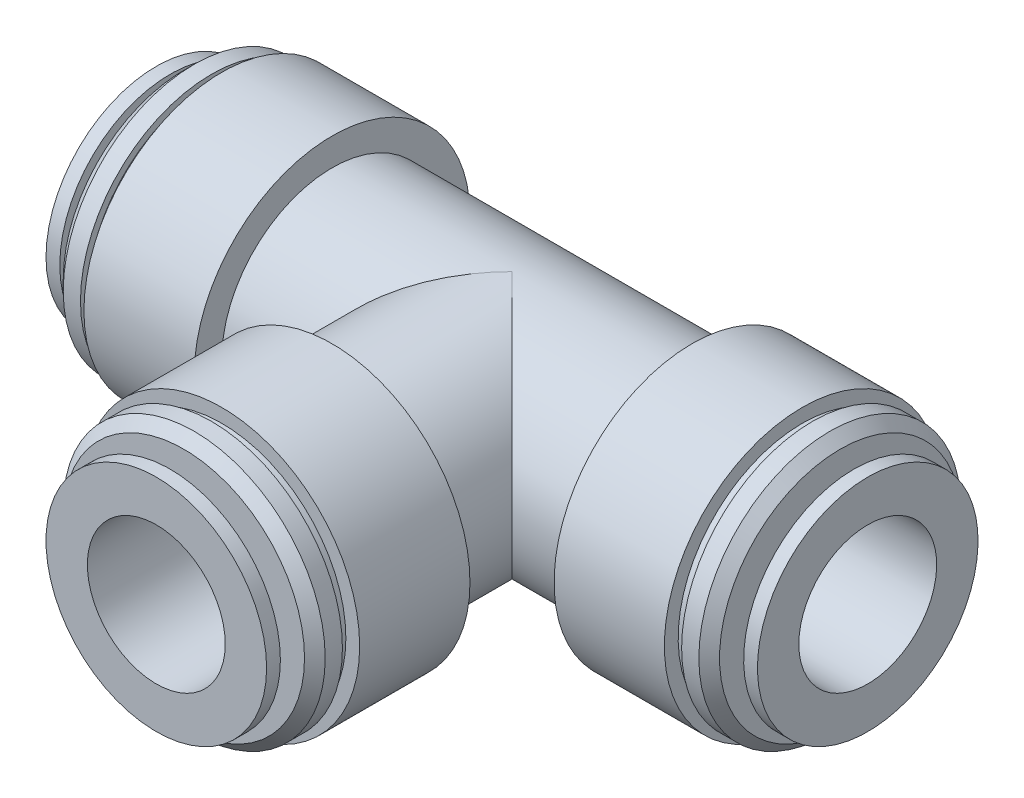
ISO-10303-21;
HEADER;
FILE_DESCRIPTION(('STEP AP214'),'2;1');
FILE_NAME('part.step','',(''),(''),'','','');
FILE_SCHEMA(('AUTOMOTIVE_DESIGN { 1 0 10303 214 1 1 1 1 }'));
ENDSEC;
DATA;
#1=APPLICATION_CONTEXT('core data for automotive mechanical design processes');
#2=APPLICATION_PROTOCOL_DEFINITION('international standard','automotive_design',2000,#1);
#3=PRODUCT_CONTEXT('',#1,'mechanical');
#4=PRODUCT('Part','Part','',(#3));
#5=PRODUCT_RELATED_PRODUCT_CATEGORY('part','',(#4));
#6=PRODUCT_DEFINITION_FORMATION('','',#4);
#7=PRODUCT_DEFINITION_CONTEXT('part definition',#1,'design');
#8=PRODUCT_DEFINITION('design','',#6,#7);
#9=PRODUCT_DEFINITION_SHAPE('','',#8);
#10=(LENGTH_UNIT() NAMED_UNIT(*) SI_UNIT(.MILLI.,.METRE.));
#11=(NAMED_UNIT(*) PLANE_ANGLE_UNIT() SI_UNIT($,.RADIAN.));
#12=(NAMED_UNIT(*) SI_UNIT($,.STERADIAN.) SOLID_ANGLE_UNIT());
#13=UNCERTAINTY_MEASURE_WITH_UNIT(LENGTH_MEASURE(1.E-05),#10,'distance_accuracy_value','');
#14=(GEOMETRIC_REPRESENTATION_CONTEXT(3) GLOBAL_UNCERTAINTY_ASSIGNED_CONTEXT((#13)) GLOBAL_UNIT_ASSIGNED_CONTEXT((#10,
#11,#12)) REPRESENTATION_CONTEXT('',''));
#15=CARTESIAN_POINT('',(0.,0.,0.));
#16=DIRECTION('',(0.,0.,1.));
#17=DIRECTION('',(1.,0.,0.));
#18=AXIS2_PLACEMENT_3D('',#15,#16,#17);
#19=CARTESIAN_POINT('',(45.3,0.,0.));
#20=DIRECTION('',(-1.,0.,0.));
#21=DIRECTION('',(0.,0.,1.));
#22=AXIS2_PLACEMENT_3D('',#19,#20,#21);
#23=CYLINDRICAL_SURFACE('',#22,5.);
#24=CARTESIAN_POINT('',(-17.75,0.,0.));
#25=DIRECTION('',(-1.,0.,0.));
#26=DIRECTION('',(0.,0.,1.));
#27=AXIS2_PLACEMENT_3D('',#24,#25,#26);
#28=CIRCLE('',#27,5.);
#29=CARTESIAN_POINT('',(-17.75,0.,5.));
#30=VERTEX_POINT('',#29);
#31=EDGE_CURVE('E78',#30,#30,#28,.T.);
#32=ORIENTED_EDGE('',*,*,#31,.T.);
#33=EDGE_LOOP('',(#32));
#34=FACE_BOUND('',#33,.T.);
#35=CARTESIAN_POINT('',(33.8500000000001,0.,0.));
#36=DIRECTION('',(1.,0.,0.));
#37=DIRECTION('',(0.,1.,0.));
#38=AXIS2_PLACEMENT_3D('',#35,#36,#37);
#39=CIRCLE('',#38,5.);
#40=CARTESIAN_POINT('',(33.8500000000001,5.,0.));
#41=VERTEX_POINT('',#40);
#42=EDGE_CURVE('E85',#41,#41,#39,.T.);
#43=ORIENTED_EDGE('',*,*,#42,.T.);
#44=EDGE_LOOP('',(#43));
#45=FACE_BOUND('',#44,.T.);
#46=DIRECTION('',(-1.,0.,0.));
#47=VECTOR('',#46,1.);
#48=CARTESIAN_POINT('',(45.3,4.93558507170123,0.799999999999988));
#49=LINE('',#48,#47);
#50=CARTESIAN_POINT('',(7.25000000000004,4.93558507170123,0.799999999999988));
#51=VERTEX_POINT('',#50);
#52=CARTESIAN_POINT('',(8.84999999999999,4.93558507170123,0.799999999999988));
#53=VERTEX_POINT('',#52);
#54=EDGE_CURVE('E11',#51,#53,#49,.F.);
#55=ORIENTED_EDGE('',*,*,#54,.F.);
#56=CARTESIAN_POINT('',(8.05000000000001,0.,0.));
#57=DIRECTION('',(-0.707106781186547,0.,-0.707106781186547));
#58=DIRECTION('',(-0.707106781186547,0.,0.707106781186547));
#59=AXIS2_PLACEMENT_3D('',#56,#57,#58);
#60=ELLIPSE('',#59,7.07106781186547,5.);
#61=CARTESIAN_POINT('',(7.25000000000004,-4.93558507170123,0.799999999999988));
#62=VERTEX_POINT('',#61);
#63=EDGE_CURVE('E77',#51,#62,#60,.F.);
#64=ORIENTED_EDGE('',*,*,#63,.T.);
#65=DIRECTION('',(-1.,0.,0.));
#66=VECTOR('',#65,1.);
#67=CARTESIAN_POINT('',(45.3,-4.93558507170123,0.799999999999988));
#68=LINE('',#67,#66);
#69=CARTESIAN_POINT('',(8.84999999999999,-4.93558507170123,0.799999999999988));
#70=VERTEX_POINT('',#69);
#71=EDGE_CURVE('E80',#70,#62,#68,.T.);
#72=ORIENTED_EDGE('',*,*,#71,.F.);
#73=CARTESIAN_POINT('',(8.05000000000001,0.,0.));
#74=DIRECTION('',(-0.707106781186547,0.,0.707106781186547));
#75=DIRECTION('',(-0.707106781186547,0.,-0.707106781186547));
#76=AXIS2_PLACEMENT_3D('',#73,#74,#75);
#77=ELLIPSE('',#76,7.07106781186547,5.);
#78=EDGE_CURVE('E42',#70,#53,#77,.T.);
#79=ORIENTED_EDGE('',*,*,#78,.T.);
#80=EDGE_LOOP('',(#55,#64,#72,#79));
#81=FACE_BOUND('',#80,.T.);
#82=ADVANCED_FACE('F34',(#34,#45,#81),#23,.F.);
#83=CARTESIAN_POINT('',(21.1,0.,0.));
#84=DIRECTION('',(-1.,0.,0.));
#85=DIRECTION('',(0.,0.,1.));
#86=AXIS2_PLACEMENT_3D('',#83,#84,#85);
#87=CYLINDRICAL_SURFACE('',#86,8.);
#88=CARTESIAN_POINT('',(-4.99999999999998,0.,0.));
#89=DIRECTION('',(1.,0.,0.));
#90=DIRECTION('',(0.,0.,-1.));
#91=AXIS2_PLACEMENT_3D('',#88,#89,#90);
#92=CIRCLE('',#91,8.);
#93=CARTESIAN_POINT('',(-4.99999999999998,0.,-8.));
#94=VERTEX_POINT('',#93);
#95=EDGE_CURVE('E91',#94,#94,#92,.T.);
#96=ORIENTED_EDGE('',*,*,#95,.T.);
#97=EDGE_LOOP('',(#96));
#98=FACE_BOUND('',#97,.T.);
#99=CARTESIAN_POINT('',(21.1,0.,0.));
#100=DIRECTION('',(1.,0.,0.));
#101=DIRECTION('',(0.,0.,-1.));
#102=AXIS2_PLACEMENT_3D('',#99,#100,#101);
#103=CIRCLE('',#102,8.);
#104=CARTESIAN_POINT('',(21.1,0.,-8.));
#105=VERTEX_POINT('',#104);
#106=EDGE_CURVE('E125',#105,#105,#103,.T.);
#107=ORIENTED_EDGE('',*,*,#106,.F.);
#108=EDGE_LOOP('',(#107));
#109=FACE_BOUND('',#108,.T.);
#110=CARTESIAN_POINT('',(8.05000000000002,0.,0.));
#111=DIRECTION('',(-0.707106781186547,0.,-0.707106781186547));
#112=DIRECTION('',(-0.707106781186547,0.,0.707106781186547));
#113=AXIS2_PLACEMENT_3D('',#110,#111,#112);
#114=ELLIPSE('',#113,11.3137084989848,8.);
#115=CARTESIAN_POINT('',(8.05000000000002,8.,0.));
#116=VERTEX_POINT('',#115);
#117=CARTESIAN_POINT('',(8.05000000000002,-8.,0.));
#118=VERTEX_POINT('',#117);
#119=EDGE_CURVE('E84',#116,#118,#114,.F.);
#120=ORIENTED_EDGE('',*,*,#119,.F.);
#121=CARTESIAN_POINT('',(8.05000000000002,0.,0.));
#122=DIRECTION('',(-0.707106781186547,0.,0.707106781186547));
#123=DIRECTION('',(-0.707106781186547,0.,-0.707106781186547));
#124=AXIS2_PLACEMENT_3D('',#121,#122,#123);
#125=ELLIPSE('',#124,11.3137084989848,8.);
#126=EDGE_CURVE('E55',#118,#116,#125,.T.);
#127=ORIENTED_EDGE('',*,*,#126,.F.);
#128=EDGE_LOOP('',(#120,#127));
#129=FACE_BOUND('',#128,.T.);
#130=ADVANCED_FACE('F224',(#98,#109,#129),#87,.T.);
#131=CARTESIAN_POINT('',(-21.0494892323431,0.,0.));
#132=DIRECTION('',(-1.,0.,0.));
#133=DIRECTION('',(0.,0.,1.));
#134=AXIS2_PLACEMENT_3D('',#131,#132,#133);
#135=CYLINDRICAL_SURFACE('',#134,10.);
#136=CARTESIAN_POINT('',(-4.99999999999998,0.,0.));
#137=DIRECTION('',(-1.,0.,0.));
#138=DIRECTION('',(0.,0.,1.));
#139=AXIS2_PLACEMENT_3D('',#136,#137,#138);
#140=CIRCLE('',#139,10.);
#141=CARTESIAN_POINT('',(-4.99999999999998,0.,10.));
#142=VERTEX_POINT('',#141);
#143=EDGE_CURVE('E92',#142,#142,#140,.T.);
#144=ORIENTED_EDGE('',*,*,#143,.T.);
#145=EDGE_LOOP('',(#144));
#146=FACE_BOUND('',#145,.T.);
#147=CARTESIAN_POINT('',(-13.,0.,0.));
#148=DIRECTION('',(-1.,0.,0.));
#149=DIRECTION('',(0.,0.,1.));
#150=AXIS2_PLACEMENT_3D('',#147,#148,#149);
#151=CIRCLE('',#150,10.);
#152=CARTESIAN_POINT('',(-13.,0.,10.));
#153=VERTEX_POINT('',#152);
#154=EDGE_CURVE('E122',#153,#153,#151,.T.);
#155=ORIENTED_EDGE('',*,*,#154,.F.);
#156=EDGE_LOOP('',(#155));
#157=FACE_BOUND('',#156,.T.);
#158=ADVANCED_FACE('F36',(#146,#157),#135,.T.);
#159=CARTESIAN_POINT('',(-4.99999999999998,-10.,0.));
#160=DIRECTION('',(1.,0.,0.));
#161=DIRECTION('',(0.,0.,-1.));
#162=AXIS2_PLACEMENT_3D('',#159,#160,#161);
#163=PLANE('',#162);
#164=ORIENTED_EDGE('',*,*,#95,.F.);
#165=EDGE_LOOP('',(#164));
#166=FACE_BOUND('',#165,.T.);
#167=ORIENTED_EDGE('',*,*,#143,.F.);
#168=EDGE_LOOP('',(#167));
#169=FACE_BOUND('',#168,.T.);
#170=ADVANCED_FACE('F580',(#166,#169),#163,.T.);
#171=CARTESIAN_POINT('',(-17.75,-4.,0.));
#172=DIRECTION('',(-1.,0.,0.));
#173=DIRECTION('',(0.,0.,1.));
#174=AXIS2_PLACEMENT_3D('',#171,#172,#173);
#175=PLANE('',#174);
#176=ORIENTED_EDGE('',*,*,#31,.F.);
#177=EDGE_LOOP('',(#176));
#178=FACE_BOUND('',#177,.T.);
#179=CARTESIAN_POINT('',(-17.75,0.,0.));
#180=DIRECTION('',(-1.,0.,0.));
#181=DIRECTION('',(0.,0.,1.));
#182=AXIS2_PLACEMENT_3D('',#179,#180,#181);
#183=CIRCLE('',#182,8.);
#184=CARTESIAN_POINT('',(-17.75,0.,8.));
#185=VERTEX_POINT('',#184);
#186=EDGE_CURVE('E95',#185,#185,#183,.T.);
#187=ORIENTED_EDGE('',*,*,#186,.T.);
#188=EDGE_LOOP('',(#187));
#189=FACE_BOUND('',#188,.T.);
#190=ADVANCED_FACE('F571',(#178,#189),#175,.T.);
#191=CARTESIAN_POINT('',(-21.0494892323431,0.,0.));
#192=DIRECTION('',(-1.,0.,0.));
#193=DIRECTION('',(0.,0.,1.));
#194=AXIS2_PLACEMENT_3D('',#191,#192,#193);
#195=CYLINDRICAL_SURFACE('',#194,8.);
#196=CARTESIAN_POINT('',(-16.7499999999999,0.,0.));
#197=DIRECTION('',(-1.,0.,0.));
#198=DIRECTION('',(0.,0.,1.));
#199=AXIS2_PLACEMENT_3D('',#196,#197,#198);
#200=CIRCLE('',#199,8.);
#201=CARTESIAN_POINT('',(-16.7499999999999,0.,8.));
#202=VERTEX_POINT('',#201);
#203=EDGE_CURVE('E98',#202,#202,#200,.T.);
#204=ORIENTED_EDGE('',*,*,#203,.T.);
#205=EDGE_LOOP('',(#204));
#206=FACE_BOUND('',#205,.T.);
#207=ORIENTED_EDGE('',*,*,#186,.F.);
#208=EDGE_LOOP('',(#207));
#209=FACE_BOUND('',#208,.T.);
#210=ADVANCED_FACE('F562',(#206,#209),#195,.T.);
#211=CARTESIAN_POINT('',(-16.7499999999999,-8.,0.));
#212=DIRECTION('',(1.,0.,0.));
#213=DIRECTION('',(0.,0.,-1.));
#214=AXIS2_PLACEMENT_3D('',#211,#212,#213);
#215=PLANE('',#214);
#216=CARTESIAN_POINT('',(-16.7499999999999,0.,0.));
#217=DIRECTION('',(-1.,0.,0.));
#218=DIRECTION('',(0.,0.,1.));
#219=AXIS2_PLACEMENT_3D('',#216,#217,#218);
#220=CIRCLE('',#219,5.99999999999998);
#221=CARTESIAN_POINT('',(-16.7499999999999,0.,5.99999999999998));
#222=VERTEX_POINT('',#221);
#223=EDGE_CURVE('E101',#222,#222,#220,.T.);
#224=ORIENTED_EDGE('',*,*,#223,.T.);
#225=EDGE_LOOP('',(#224));
#226=FACE_BOUND('',#225,.T.);
#227=ORIENTED_EDGE('',*,*,#203,.F.);
#228=EDGE_LOOP('',(#227));
#229=FACE_BOUND('',#228,.T.);
#230=ADVANCED_FACE('F553',(#226,#229),#215,.T.);
#231=CARTESIAN_POINT('',(-21.0494892323431,0.,0.));
#232=DIRECTION('',(-1.,0.,0.));
#233=DIRECTION('',(0.,0.,1.));
#234=AXIS2_PLACEMENT_3D('',#231,#232,#233);
#235=CYLINDRICAL_SURFACE('',#234,5.99999999999998);
#236=CARTESIAN_POINT('',(-15.75,0.,0.));
#237=DIRECTION('',(-1.,0.,0.));
#238=DIRECTION('',(0.,0.,1.));
#239=AXIS2_PLACEMENT_3D('',#236,#237,#238);
#240=CIRCLE('',#239,5.99999999999998);
#241=CARTESIAN_POINT('',(-15.75,0.,5.99999999999998));
#242=VERTEX_POINT('',#241);
#243=EDGE_CURVE('E104',#242,#242,#240,.T.);
#244=ORIENTED_EDGE('',*,*,#243,.T.);
#245=EDGE_LOOP('',(#244));
#246=FACE_BOUND('',#245,.T.);
#247=ORIENTED_EDGE('',*,*,#223,.F.);
#248=EDGE_LOOP('',(#247));
#249=FACE_BOUND('',#248,.T.);
#250=ADVANCED_FACE('F544',(#246,#249),#235,.T.);
#251=CARTESIAN_POINT('',(-15.75,-5.99999999999998,0.));
#252=DIRECTION('',(-1.,0.,0.));
#253=DIRECTION('',(0.,0.,1.));
#254=AXIS2_PLACEMENT_3D('',#251,#252,#253);
#255=PLANE('',#254);
#256=CARTESIAN_POINT('',(-15.75,0.,0.));
#257=DIRECTION('',(-1.,0.,0.));
#258=DIRECTION('',(0.,0.,1.));
#259=AXIS2_PLACEMENT_3D('',#256,#257,#258);
#260=CIRCLE('',#259,8.74999999999998);
#261=CARTESIAN_POINT('',(-15.75,0.,8.74999999999998));
#262=VERTEX_POINT('',#261);
#263=EDGE_CURVE('E107',#262,#262,#260,.T.);
#264=ORIENTED_EDGE('',*,*,#263,.T.);
#265=EDGE_LOOP('',(#264));
#266=FACE_BOUND('',#265,.T.);
#267=ORIENTED_EDGE('',*,*,#243,.F.);
#268=EDGE_LOOP('',(#267));
#269=FACE_BOUND('',#268,.T.);
#270=ADVANCED_FACE('F535',(#266,#269),#255,.T.);
#271=CARTESIAN_POINT('',(-15.75,0.,0.));
#272=DIRECTION('',(1.,0.,0.));
#273=DIRECTION('',(0.,0.,-1.));
#274=AXIS2_PLACEMENT_3D('',#271,#272,#273);
#275=CONICAL_SURFACE('',#274,8.74999999999998,0.785398163397448);
#276=CARTESIAN_POINT('',(-15.,0.,0.));
#277=DIRECTION('',(-1.,0.,0.));
#278=DIRECTION('',(0.,0.,1.));
#279=AXIS2_PLACEMENT_3D('',#276,#277,#278);
#280=CIRCLE('',#279,9.49999999999998);
#281=CARTESIAN_POINT('',(-15.,0.,9.49999999999998));
#282=VERTEX_POINT('',#281);
#283=EDGE_CURVE('E110',#282,#282,#280,.T.);
#284=ORIENTED_EDGE('',*,*,#283,.T.);
#285=EDGE_LOOP('',(#284));
#286=FACE_BOUND('',#285,.T.);
#287=ORIENTED_EDGE('',*,*,#263,.F.);
#288=EDGE_LOOP('',(#287));
#289=FACE_BOUND('',#288,.T.);
#290=ADVANCED_FACE('F526',(#286,#289),#275,.T.);
#291=CARTESIAN_POINT('',(-21.0494892323431,0.,0.));
#292=DIRECTION('',(-1.,0.,0.));
#293=DIRECTION('',(0.,0.,1.));
#294=AXIS2_PLACEMENT_3D('',#291,#292,#293);
#295=CYLINDRICAL_SURFACE('',#294,9.49999999999998);
#296=CARTESIAN_POINT('',(-13.75,0.,0.));
#297=DIRECTION('',(-1.,0.,0.));
#298=DIRECTION('',(0.,0.,1.));
#299=AXIS2_PLACEMENT_3D('',#296,#297,#298);
#300=CIRCLE('',#299,9.49999999999998);
#301=CARTESIAN_POINT('',(-13.75,0.,9.49999999999998));
#302=VERTEX_POINT('',#301);
#303=EDGE_CURVE('E113',#302,#302,#300,.T.);
#304=ORIENTED_EDGE('',*,*,#303,.T.);
#305=EDGE_LOOP('',(#304));
#306=FACE_BOUND('',#305,.T.);
#307=ORIENTED_EDGE('',*,*,#283,.F.);
#308=EDGE_LOOP('',(#307));
#309=FACE_BOUND('',#308,.T.);
#310=ADVANCED_FACE('F517',(#306,#309),#295,.T.);
#311=CARTESIAN_POINT('',(-13.75,-9.49999999999998,0.));
#312=DIRECTION('',(1.,0.,0.));
#313=DIRECTION('',(0.,0.,-1.));
#314=AXIS2_PLACEMENT_3D('',#311,#312,#313);
#315=PLANE('',#314);
#316=CARTESIAN_POINT('',(-13.75,0.,0.));
#317=DIRECTION('',(-1.,0.,0.));
#318=DIRECTION('',(0.,0.,1.));
#319=AXIS2_PLACEMENT_3D('',#316,#317,#318);
#320=CIRCLE('',#319,8.99999999999996);
#321=CARTESIAN_POINT('',(-13.75,0.,8.99999999999996));
#322=VERTEX_POINT('',#321);
#323=EDGE_CURVE('E116',#322,#322,#320,.T.);
#324=ORIENTED_EDGE('',*,*,#323,.T.);
#325=EDGE_LOOP('',(#324));
#326=FACE_BOUND('',#325,.T.);
#327=ORIENTED_EDGE('',*,*,#303,.F.);
#328=EDGE_LOOP('',(#327));
#329=FACE_BOUND('',#328,.T.);
#330=ADVANCED_FACE('F508',(#326,#329),#315,.T.);
#331=CARTESIAN_POINT('',(-21.0494892323431,0.,0.));
#332=DIRECTION('',(-1.,0.,0.));
#333=DIRECTION('',(0.,0.,1.));
#334=AXIS2_PLACEMENT_3D('',#331,#332,#333);
#335=CYLINDRICAL_SURFACE('',#334,8.99999999999996);
#336=CARTESIAN_POINT('',(-13.,0.,0.));
#337=DIRECTION('',(-1.,0.,0.));
#338=DIRECTION('',(0.,0.,1.));
#339=AXIS2_PLACEMENT_3D('',#336,#337,#338);
#340=CIRCLE('',#339,8.99999999999996);
#341=CARTESIAN_POINT('',(-13.,0.,8.99999999999996));
#342=VERTEX_POINT('',#341);
#343=EDGE_CURVE('E119',#342,#342,#340,.T.);
#344=ORIENTED_EDGE('',*,*,#343,.T.);
#345=EDGE_LOOP('',(#344));
#346=FACE_BOUND('',#345,.T.);
#347=ORIENTED_EDGE('',*,*,#323,.F.);
#348=EDGE_LOOP('',(#347));
#349=FACE_BOUND('',#348,.T.);
#350=ADVANCED_FACE('F499',(#346,#349),#335,.T.);
#351=CARTESIAN_POINT('',(-13.,-8.99999999999996,0.));
#352=DIRECTION('',(-1.,0.,0.));
#353=DIRECTION('',(0.,0.,1.));
#354=AXIS2_PLACEMENT_3D('',#351,#352,#353);
#355=PLANE('',#354);
#356=ORIENTED_EDGE('',*,*,#154,.T.);
#357=EDGE_LOOP('',(#356));
#358=FACE_BOUND('',#357,.T.);
#359=ORIENTED_EDGE('',*,*,#343,.F.);
#360=EDGE_LOOP('',(#359));
#361=FACE_BOUND('',#360,.T.);
#362=ADVANCED_FACE('F489',(#358,#361),#355,.T.);
#363=CARTESIAN_POINT('',(47.149489232343,1.48318857196017E-13,0.));
#364=DIRECTION('',(1.,0.,0.));
#365=DIRECTION('',(0.,1.,0.));
#366=AXIS2_PLACEMENT_3D('',#363,#364,#365);
#367=CYLINDRICAL_SURFACE('',#366,10.);
#368=CARTESIAN_POINT('',(21.1000000000001,0.,0.));
#369=DIRECTION('',(1.,0.,0.));
#370=DIRECTION('',(0.,1.,0.));
#371=AXIS2_PLACEMENT_3D('',#368,#369,#370);
#372=CIRCLE('',#371,10.0000000000001);
#373=CARTESIAN_POINT('',(21.1,10.0000000000001,0.));
#374=VERTEX_POINT('',#373);
#375=EDGE_CURVE('E130',#374,#374,#372,.T.);
#376=ORIENTED_EDGE('',*,*,#375,.T.);
#377=EDGE_LOOP('',(#376));
#378=FACE_BOUND('',#377,.T.);
#379=CARTESIAN_POINT('',(29.1000000000001,0.,0.));
#380=DIRECTION('',(1.,0.,0.));
#381=DIRECTION('',(0.,1.,0.));
#382=AXIS2_PLACEMENT_3D('',#379,#380,#381);
#383=CIRCLE('',#382,10.);
#384=CARTESIAN_POINT('',(29.1,10.0000000000001,0.));
#385=VERTEX_POINT('',#384);
#386=EDGE_CURVE('E160',#385,#385,#383,.T.);
#387=ORIENTED_EDGE('',*,*,#386,.F.);
#388=EDGE_LOOP('',(#387));
#389=FACE_BOUND('',#388,.T.);
#390=ADVANCED_FACE('F480',(#378,#389),#367,.T.);
#391=CARTESIAN_POINT('',(21.1,10.0000000000001,0.));
#392=DIRECTION('',(-1.,0.,0.));
#393=DIRECTION('',(0.,-1.,0.));
#394=AXIS2_PLACEMENT_3D('',#391,#392,#393);
#395=PLANE('',#394);
#396=ORIENTED_EDGE('',*,*,#106,.T.);
#397=EDGE_LOOP('',(#396));
#398=FACE_BOUND('',#397,.T.);
#399=ORIENTED_EDGE('',*,*,#375,.F.);
#400=EDGE_LOOP('',(#399));
#401=FACE_BOUND('',#400,.T.);
#402=ADVANCED_FACE('F472',(#398,#401),#395,.T.);
#403=CARTESIAN_POINT('',(33.8500000000001,3.99999999999987,0.));
#404=DIRECTION('',(1.,0.,0.));
#405=DIRECTION('',(0.,1.,0.));
#406=AXIS2_PLACEMENT_3D('',#403,#404,#405);
#407=PLANE('',#406);
#408=ORIENTED_EDGE('',*,*,#42,.F.);
#409=EDGE_LOOP('',(#408));
#410=FACE_BOUND('',#409,.T.);
#411=CARTESIAN_POINT('',(33.8500000000002,0.,0.));
#412=DIRECTION('',(1.,0.,0.));
#413=DIRECTION('',(0.,1.,0.));
#414=AXIS2_PLACEMENT_3D('',#411,#412,#413);
#415=CIRCLE('',#414,8.00000000000002);
#416=CARTESIAN_POINT('',(33.8500000000001,8.00000000000011,0.));
#417=VERTEX_POINT('',#416);
#418=EDGE_CURVE('E133',#417,#417,#415,.T.);
#419=ORIENTED_EDGE('',*,*,#418,.T.);
#420=EDGE_LOOP('',(#419));
#421=FACE_BOUND('',#420,.T.);
#422=ADVANCED_FACE('F463',(#410,#421),#407,.T.);
#423=CARTESIAN_POINT('',(47.149489232343,1.48318857196017E-13,0.));
#424=DIRECTION('',(1.,0.,0.));
#425=DIRECTION('',(0.,1.,0.));
#426=AXIS2_PLACEMENT_3D('',#423,#424,#425);
#427=CYLINDRICAL_SURFACE('',#426,8.00000000000002);
#428=CARTESIAN_POINT('',(32.85,0.,0.));
#429=DIRECTION('',(1.,0.,0.));
#430=DIRECTION('',(0.,1.,0.));
#431=AXIS2_PLACEMENT_3D('',#428,#429,#430);
#432=CIRCLE('',#431,8.00000000000003);
#433=CARTESIAN_POINT('',(32.85,8.00000000000011,0.));
#434=VERTEX_POINT('',#433);
#435=EDGE_CURVE('E136',#434,#434,#432,.T.);
#436=ORIENTED_EDGE('',*,*,#435,.T.);
#437=EDGE_LOOP('',(#436));
#438=FACE_BOUND('',#437,.T.);
#439=ORIENTED_EDGE('',*,*,#418,.F.);
#440=EDGE_LOOP('',(#439));
#441=FACE_BOUND('',#440,.T.);
#442=ADVANCED_FACE('F454',(#438,#441),#427,.T.);
#443=CARTESIAN_POINT('',(32.85,8.00000000000011,0.));
#444=DIRECTION('',(-1.,0.,0.));
#445=DIRECTION('',(0.,-1.,0.));
#446=AXIS2_PLACEMENT_3D('',#443,#444,#445);
#447=PLANE('',#446);
#448=CARTESIAN_POINT('',(32.85,0.,0.));
#449=DIRECTION('',(1.,0.,0.));
#450=DIRECTION('',(0.,1.,0.));
#451=AXIS2_PLACEMENT_3D('',#448,#449,#450);
#452=CIRCLE('',#451,6.);
#453=CARTESIAN_POINT('',(32.85,6.00000000000008,0.));
#454=VERTEX_POINT('',#453);
#455=EDGE_CURVE('E139',#454,#454,#452,.T.);
#456=ORIENTED_EDGE('',*,*,#455,.T.);
#457=EDGE_LOOP('',(#456));
#458=FACE_BOUND('',#457,.T.);
#459=ORIENTED_EDGE('',*,*,#435,.F.);
#460=EDGE_LOOP('',(#459));
#461=FACE_BOUND('',#460,.T.);
#462=ADVANCED_FACE('F445',(#458,#461),#447,.T.);
#463=CARTESIAN_POINT('',(47.149489232343,1.48318857196017E-13,0.));
#464=DIRECTION('',(1.,0.,0.));
#465=DIRECTION('',(0.,1.,0.));
#466=AXIS2_PLACEMENT_3D('',#463,#464,#465);
#467=CYLINDRICAL_SURFACE('',#466,6.);
#468=CARTESIAN_POINT('',(31.85,0.,0.));
#469=DIRECTION('',(1.,0.,0.));
#470=DIRECTION('',(0.,1.,0.));
#471=AXIS2_PLACEMENT_3D('',#468,#469,#470);
#472=CIRCLE('',#471,6.);
#473=CARTESIAN_POINT('',(31.85,6.00000000000008,0.));
#474=VERTEX_POINT('',#473);
#475=EDGE_CURVE('E142',#474,#474,#472,.T.);
#476=ORIENTED_EDGE('',*,*,#475,.T.);
#477=EDGE_LOOP('',(#476));
#478=FACE_BOUND('',#477,.T.);
#479=ORIENTED_EDGE('',*,*,#455,.F.);
#480=EDGE_LOOP('',(#479));
#481=FACE_BOUND('',#480,.T.);
#482=ADVANCED_FACE('F436',(#478,#481),#467,.T.);
#483=CARTESIAN_POINT('',(31.85,6.00000000000008,0.));
#484=DIRECTION('',(1.,0.,0.));
#485=DIRECTION('',(0.,1.,0.));
#486=AXIS2_PLACEMENT_3D('',#483,#484,#485);
#487=PLANE('',#486);
#488=CARTESIAN_POINT('',(31.8500000000001,0.,0.));
#489=DIRECTION('',(1.,0.,0.));
#490=DIRECTION('',(0.,1.,0.));
#491=AXIS2_PLACEMENT_3D('',#488,#489,#490);
#492=CIRCLE('',#491,8.74999999999999);
#493=CARTESIAN_POINT('',(31.85,8.75000000000007,0.));
#494=VERTEX_POINT('',#493);
#495=EDGE_CURVE('E145',#494,#494,#492,.T.);
#496=ORIENTED_EDGE('',*,*,#495,.T.);
#497=EDGE_LOOP('',(#496));
#498=FACE_BOUND('',#497,.T.);
#499=ORIENTED_EDGE('',*,*,#475,.F.);
#500=EDGE_LOOP('',(#499));
#501=FACE_BOUND('',#500,.T.);
#502=ADVANCED_FACE('F427',(#498,#501),#487,.T.);
#503=CARTESIAN_POINT('',(31.8500000000001,0.,0.));
#504=DIRECTION('',(-1.,0.,0.));
#505=DIRECTION('',(0.,-1.,0.));
#506=AXIS2_PLACEMENT_3D('',#503,#504,#505);
#507=CONICAL_SURFACE('',#506,8.75,0.785398163397451);
#508=CARTESIAN_POINT('',(31.1000000000001,0.,0.));
#509=DIRECTION('',(1.,0.,0.));
#510=DIRECTION('',(0.,1.,0.));
#511=AXIS2_PLACEMENT_3D('',#508,#509,#510);
#512=CIRCLE('',#511,9.5);
#513=CARTESIAN_POINT('',(31.1,9.50000000000007,0.));
#514=VERTEX_POINT('',#513);
#515=EDGE_CURVE('E148',#514,#514,#512,.T.);
#516=ORIENTED_EDGE('',*,*,#515,.T.);
#517=EDGE_LOOP('',(#516));
#518=FACE_BOUND('',#517,.T.);
#519=ORIENTED_EDGE('',*,*,#495,.F.);
#520=EDGE_LOOP('',(#519));
#521=FACE_BOUND('',#520,.T.);
#522=ADVANCED_FACE('F418',(#518,#521),#507,.T.);
#523=CARTESIAN_POINT('',(47.149489232343,1.48318857196017E-13,0.));
#524=DIRECTION('',(1.,0.,0.));
#525=DIRECTION('',(0.,1.,0.));
#526=AXIS2_PLACEMENT_3D('',#523,#524,#525);
#527=CYLINDRICAL_SURFACE('',#526,9.5);
#528=CARTESIAN_POINT('',(29.8500000000001,0.,0.));
#529=DIRECTION('',(1.,0.,0.));
#530=DIRECTION('',(0.,1.,0.));
#531=AXIS2_PLACEMENT_3D('',#528,#529,#530);
#532=CIRCLE('',#531,9.5);
#533=CARTESIAN_POINT('',(29.85,9.50000000000007,0.));
#534=VERTEX_POINT('',#533);
#535=EDGE_CURVE('E151',#534,#534,#532,.T.);
#536=ORIENTED_EDGE('',*,*,#535,.T.);
#537=EDGE_LOOP('',(#536));
#538=FACE_BOUND('',#537,.T.);
#539=ORIENTED_EDGE('',*,*,#515,.F.);
#540=EDGE_LOOP('',(#539));
#541=FACE_BOUND('',#540,.T.);
#542=ADVANCED_FACE('F409',(#538,#541),#527,.T.);
#543=CARTESIAN_POINT('',(29.85,9.50000000000007,0.));
#544=DIRECTION('',(-1.,0.,0.));
#545=DIRECTION('',(0.,-1.,0.));
#546=AXIS2_PLACEMENT_3D('',#543,#544,#545);
#547=PLANE('',#546);
#548=CARTESIAN_POINT('',(29.8500000000001,0.,0.));
#549=DIRECTION('',(1.,0.,0.));
#550=DIRECTION('',(0.,1.,0.));
#551=AXIS2_PLACEMENT_3D('',#548,#549,#550);
#552=CIRCLE('',#551,9.);
#553=CARTESIAN_POINT('',(29.85,9.00000000000007,0.));
#554=VERTEX_POINT('',#553);
#555=EDGE_CURVE('E154',#554,#554,#552,.T.);
#556=ORIENTED_EDGE('',*,*,#555,.T.);
#557=EDGE_LOOP('',(#556));
#558=FACE_BOUND('',#557,.T.);
#559=ORIENTED_EDGE('',*,*,#535,.F.);
#560=EDGE_LOOP('',(#559));
#561=FACE_BOUND('',#560,.T.);
#562=ADVANCED_FACE('F400',(#558,#561),#547,.T.);
#563=CARTESIAN_POINT('',(47.149489232343,1.48318857196017E-13,0.));
#564=DIRECTION('',(1.,0.,0.));
#565=DIRECTION('',(0.,1.,0.));
#566=AXIS2_PLACEMENT_3D('',#563,#564,#565);
#567=CYLINDRICAL_SURFACE('',#566,9.);
#568=CARTESIAN_POINT('',(29.1000000000001,0.,0.));
#569=DIRECTION('',(1.,0.,0.));
#570=DIRECTION('',(0.,1.,0.));
#571=AXIS2_PLACEMENT_3D('',#568,#569,#570);
#572=CIRCLE('',#571,9.);
#573=CARTESIAN_POINT('',(29.1,9.00000000000007,0.));
#574=VERTEX_POINT('',#573);
#575=EDGE_CURVE('E157',#574,#574,#572,.T.);
#576=ORIENTED_EDGE('',*,*,#575,.T.);
#577=EDGE_LOOP('',(#576));
#578=FACE_BOUND('',#577,.T.);
#579=ORIENTED_EDGE('',*,*,#555,.F.);
#580=EDGE_LOOP('',(#579));
#581=FACE_BOUND('',#580,.T.);
#582=ADVANCED_FACE('F391',(#578,#581),#567,.T.);
#583=CARTESIAN_POINT('',(29.1,9.00000000000007,0.));
#584=DIRECTION('',(1.,0.,0.));
#585=DIRECTION('',(0.,1.,0.));
#586=AXIS2_PLACEMENT_3D('',#583,#584,#585);
#587=PLANE('',#586);
#588=ORIENTED_EDGE('',*,*,#386,.T.);
#589=EDGE_LOOP('',(#588));
#590=FACE_BOUND('',#589,.T.);
#591=ORIENTED_EDGE('',*,*,#575,.F.);
#592=EDGE_LOOP('',(#591));
#593=FACE_BOUND('',#592,.T.);
#594=ADVANCED_FACE('F377',(#590,#593),#587,.T.);
#595=CARTESIAN_POINT('',(8.05000000000002,0.,13.05));
#596=DIRECTION('',(0.,0.,-1.));
#597=DIRECTION('',(-1.,0.,0.));
#598=AXIS2_PLACEMENT_3D('',#595,#596,#597);
#599=CYLINDRICAL_SURFACE('',#598,8.);
#600=CARTESIAN_POINT('',(8.05000000000002,0.,13.05));
#601=DIRECTION('',(0.,0.,1.));
#602=DIRECTION('',(1.,0.,0.));
#603=AXIS2_PLACEMENT_3D('',#600,#601,#602);
#604=CIRCLE('',#603,8.);
#605=CARTESIAN_POINT('',(16.05,0.,13.05));
#606=VERTEX_POINT('',#605);
#607=EDGE_CURVE('E163',#606,#606,#604,.T.);
#608=ORIENTED_EDGE('',*,*,#607,.F.);
#609=EDGE_LOOP('',(#608));
#610=FACE_BOUND('',#609,.T.);
#611=ORIENTED_EDGE('',*,*,#126,.T.);
#612=ORIENTED_EDGE('',*,*,#119,.T.);
#613=EDGE_LOOP('',(#611,#612));
#614=FACE_BOUND('',#613,.T.);
#615=ADVANCED_FACE('F368',(#610,#614),#599,.T.);
#616=CARTESIAN_POINT('',(8.05000000000002,0.,29.099489232343));
#617=DIRECTION('',(0.,0.,1.));
#618=DIRECTION('',(1.,0.,0.));
#619=AXIS2_PLACEMENT_3D('',#616,#617,#618);
#620=CYLINDRICAL_SURFACE('',#619,10.);
#621=CARTESIAN_POINT('',(8.05000000000002,0.,13.0499999999998));
#622=DIRECTION('',(0.,0.,1.));
#623=DIRECTION('',(1.,0.,0.));
#624=AXIS2_PLACEMENT_3D('',#621,#622,#623);
#625=CIRCLE('',#624,10.);
#626=CARTESIAN_POINT('',(18.05,0.,13.0499999999998));
#627=VERTEX_POINT('',#626);
#628=EDGE_CURVE('E166',#627,#627,#625,.T.);
#629=ORIENTED_EDGE('',*,*,#628,.T.);
#630=EDGE_LOOP('',(#629));
#631=FACE_BOUND('',#630,.T.);
#632=CARTESIAN_POINT('',(8.05000000000002,0.,21.0499999999999));
#633=DIRECTION('',(0.,0.,1.));
#634=DIRECTION('',(1.,0.,0.));
#635=AXIS2_PLACEMENT_3D('',#632,#633,#634);
#636=CIRCLE('',#635,10.);
#637=CARTESIAN_POINT('',(18.05,0.,21.0499999999999));
#638=VERTEX_POINT('',#637);
#639=EDGE_CURVE('E88',#638,#638,#636,.T.);
#640=ORIENTED_EDGE('',*,*,#639,.F.);
#641=EDGE_LOOP('',(#640));
#642=FACE_BOUND('',#641,.T.);
#643=ADVANCED_FACE('F359',(#631,#642),#620,.T.);
#644=CARTESIAN_POINT('',(18.05,0.,13.0499999999998));
#645=DIRECTION('',(0.,0.,-1.));
#646=DIRECTION('',(-1.,0.,0.));
#647=AXIS2_PLACEMENT_3D('',#644,#645,#646);
#648=PLANE('',#647);
#649=ORIENTED_EDGE('',*,*,#607,.T.);
#650=EDGE_LOOP('',(#649));
#651=FACE_BOUND('',#650,.T.);
#652=ORIENTED_EDGE('',*,*,#628,.F.);
#653=EDGE_LOOP('',(#652));
#654=FACE_BOUND('',#653,.T.);
#655=ADVANCED_FACE('F209',(#651,#654),#648,.T.);
#656=CARTESIAN_POINT('',(12.0499999999998,0.,25.8));
#657=DIRECTION('',(0.,0.,1.));
#658=DIRECTION('',(1.,0.,0.));
#659=AXIS2_PLACEMENT_3D('',#656,#657,#658);
#660=PLANE('',#659);
#661=CARTESIAN_POINT('',(8.05000000000002,0.,25.8));
#662=DIRECTION('',(0.,0.,1.));
#663=DIRECTION('',(1.,0.,0.));
#664=AXIS2_PLACEMENT_3D('',#661,#662,#663);
#665=CIRCLE('',#664,5.);
#666=CARTESIAN_POINT('',(13.05,0.,25.8));
#667=VERTEX_POINT('',#666);
#668=EDGE_CURVE('E200',#667,#667,#665,.T.);
#669=ORIENTED_EDGE('',*,*,#668,.F.);
#670=EDGE_LOOP('',(#669));
#671=FACE_BOUND('',#670,.T.);
#672=CARTESIAN_POINT('',(8.05000000000002,0.,25.8));
#673=DIRECTION('',(0.,0.,1.));
#674=DIRECTION('',(1.,0.,0.));
#675=AXIS2_PLACEMENT_3D('',#672,#673,#674);
#676=CIRCLE('',#675,8.00000000000001);
#677=CARTESIAN_POINT('',(16.05,0.,25.8));
#678=VERTEX_POINT('',#677);
#679=EDGE_CURVE('E169',#678,#678,#676,.T.);
#680=ORIENTED_EDGE('',*,*,#679,.T.);
#681=EDGE_LOOP('',(#680));
#682=FACE_BOUND('',#681,.T.);
#683=ADVANCED_FACE('F205',(#671,#682),#660,.T.);
#684=CARTESIAN_POINT('',(8.05000000000002,0.,29.099489232343));
#685=DIRECTION('',(0.,0.,1.));
#686=DIRECTION('',(1.,0.,0.));
#687=AXIS2_PLACEMENT_3D('',#684,#685,#686);
#688=CYLINDRICAL_SURFACE('',#687,8.00000000000001);
#689=CARTESIAN_POINT('',(8.05000000000002,0.,24.7999999999998));
#690=DIRECTION('',(0.,0.,1.));
#691=DIRECTION('',(1.,0.,0.));
#692=AXIS2_PLACEMENT_3D('',#689,#690,#691);
#693=CIRCLE('',#692,8.00000000000001);
#694=CARTESIAN_POINT('',(16.05,0.,24.7999999999998));
#695=VERTEX_POINT('',#694);
#696=EDGE_CURVE('E172',#695,#695,#693,.T.);
#697=ORIENTED_EDGE('',*,*,#696,.T.);
#698=EDGE_LOOP('',(#697));
#699=FACE_BOUND('',#698,.T.);
#700=ORIENTED_EDGE('',*,*,#679,.F.);
#701=EDGE_LOOP('',(#700));
#702=FACE_BOUND('',#701,.T.);
#703=ADVANCED_FACE('F208',(#699,#702),#688,.T.);
#704=CARTESIAN_POINT('',(16.05,0.,24.7999999999998));
#705=DIRECTION('',(0.,0.,-1.));
#706=DIRECTION('',(-1.,0.,0.));
#707=AXIS2_PLACEMENT_3D('',#704,#705,#706);
#708=PLANE('',#707);
#709=CARTESIAN_POINT('',(8.05000000000002,0.,24.7999999999998));
#710=DIRECTION('',(0.,0.,1.));
#711=DIRECTION('',(1.,0.,0.));
#712=AXIS2_PLACEMENT_3D('',#709,#710,#711);
#713=CIRCLE('',#712,5.99999999999998);
#714=CARTESIAN_POINT('',(14.05,0.,24.7999999999998));
#715=VERTEX_POINT('',#714);
#716=EDGE_CURVE('E175',#715,#715,#713,.T.);
#717=ORIENTED_EDGE('',*,*,#716,.T.);
#718=EDGE_LOOP('',(#717));
#719=FACE_BOUND('',#718,.T.);
#720=ORIENTED_EDGE('',*,*,#696,.F.);
#721=EDGE_LOOP('',(#720));
#722=FACE_BOUND('',#721,.T.);
#723=ADVANCED_FACE('F214',(#719,#722),#708,.T.);
#724=CARTESIAN_POINT('',(8.05000000000002,0.,29.099489232343));
#725=DIRECTION('',(0.,0.,1.));
#726=DIRECTION('',(1.,0.,0.));
#727=AXIS2_PLACEMENT_3D('',#724,#725,#726);
#728=CYLINDRICAL_SURFACE('',#727,5.99999999999998);
#729=CARTESIAN_POINT('',(8.05000000000002,0.,23.7999999999999));
#730=DIRECTION('',(0.,0.,1.));
#731=DIRECTION('',(1.,0.,0.));
#732=AXIS2_PLACEMENT_3D('',#729,#730,#731);
#733=CIRCLE('',#732,5.99999999999998);
#734=CARTESIAN_POINT('',(14.05,0.,23.7999999999999));
#735=VERTEX_POINT('',#734);
#736=EDGE_CURVE('E178',#735,#735,#733,.T.);
#737=ORIENTED_EDGE('',*,*,#736,.T.);
#738=EDGE_LOOP('',(#737));
#739=FACE_BOUND('',#738,.T.);
#740=ORIENTED_EDGE('',*,*,#716,.F.);
#741=EDGE_LOOP('',(#740));
#742=FACE_BOUND('',#741,.T.);
#743=ADVANCED_FACE('F220',(#739,#742),#728,.T.);
#744=CARTESIAN_POINT('',(14.05,0.,23.7999999999999));
#745=DIRECTION('',(0.,0.,1.));
#746=DIRECTION('',(1.,0.,0.));
#747=AXIS2_PLACEMENT_3D('',#744,#745,#746);
#748=PLANE('',#747);
#749=CARTESIAN_POINT('',(8.05000000000002,0.,23.7999999999999));
#750=DIRECTION('',(0.,0.,1.));
#751=DIRECTION('',(1.,0.,0.));
#752=AXIS2_PLACEMENT_3D('',#749,#750,#751);
#753=CIRCLE('',#752,8.74999999999991);
#754=CARTESIAN_POINT('',(16.7999999999999,0.,23.7999999999999));
#755=VERTEX_POINT('',#754);
#756=EDGE_CURVE('E181',#755,#755,#753,.T.);
#757=ORIENTED_EDGE('',*,*,#756,.T.);
#758=EDGE_LOOP('',(#757));
#759=FACE_BOUND('',#758,.T.);
#760=ORIENTED_EDGE('',*,*,#736,.F.);
#761=EDGE_LOOP('',(#760));
#762=FACE_BOUND('',#761,.T.);
#763=ADVANCED_FACE('F255',(#759,#762),#748,.T.);
#764=CARTESIAN_POINT('',(8.05000000000002,0.,23.7999999999999));
#765=DIRECTION('',(0.,0.,-1.));
#766=DIRECTION('',(-1.,0.,0.));
#767=AXIS2_PLACEMENT_3D('',#764,#765,#766);
#768=CONICAL_SURFACE('',#767,8.74999999999991,0.785398163397448);
#769=CARTESIAN_POINT('',(8.05000000000002,0.,23.0499999999999));
#770=DIRECTION('',(0.,0.,1.));
#771=DIRECTION('',(1.,0.,0.));
#772=AXIS2_PLACEMENT_3D('',#769,#770,#771);
#773=CIRCLE('',#772,9.49999999999991);
#774=CARTESIAN_POINT('',(17.5499999999999,0.,23.0499999999999));
#775=VERTEX_POINT('',#774);
#776=EDGE_CURVE('E184',#775,#775,#773,.T.);
#777=ORIENTED_EDGE('',*,*,#776,.T.);
#778=EDGE_LOOP('',(#777));
#779=FACE_BOUND('',#778,.T.);
#780=ORIENTED_EDGE('',*,*,#756,.F.);
#781=EDGE_LOOP('',(#780));
#782=FACE_BOUND('',#781,.T.);
#783=ADVANCED_FACE('F251',(#779,#782),#768,.T.);
#784=CARTESIAN_POINT('',(8.05000000000002,0.,29.099489232343));
#785=DIRECTION('',(0.,0.,1.));
#786=DIRECTION('',(1.,0.,0.));
#787=AXIS2_PLACEMENT_3D('',#784,#785,#786);
#788=CYLINDRICAL_SURFACE('',#787,9.49999999999991);
#789=CARTESIAN_POINT('',(8.05000000000002,0.,21.7999999999999));
#790=DIRECTION('',(0.,0.,1.));
#791=DIRECTION('',(1.,0.,0.));
#792=AXIS2_PLACEMENT_3D('',#789,#790,#791);
#793=CIRCLE('',#792,9.49999999999991);
#794=CARTESIAN_POINT('',(17.5499999999999,0.,21.7999999999999));
#795=VERTEX_POINT('',#794);
#796=EDGE_CURVE('E187',#795,#795,#793,.T.);
#797=ORIENTED_EDGE('',*,*,#796,.T.);
#798=EDGE_LOOP('',(#797));
#799=FACE_BOUND('',#798,.T.);
#800=ORIENTED_EDGE('',*,*,#776,.F.);
#801=EDGE_LOOP('',(#800));
#802=FACE_BOUND('',#801,.T.);
#803=ADVANCED_FACE('F247',(#799,#802),#788,.T.);
#804=CARTESIAN_POINT('',(17.5499999999999,0.,21.7999999999999));
#805=DIRECTION('',(0.,0.,-1.));
#806=DIRECTION('',(-1.,0.,0.));
#807=AXIS2_PLACEMENT_3D('',#804,#805,#806);
#808=PLANE('',#807);
#809=CARTESIAN_POINT('',(8.05000000000002,0.,21.7999999999999));
#810=DIRECTION('',(0.,0.,1.));
#811=DIRECTION('',(1.,0.,0.));
#812=AXIS2_PLACEMENT_3D('',#809,#810,#811);
#813=CIRCLE('',#812,8.99999999999996);
#814=CARTESIAN_POINT('',(17.05,0.,21.7999999999999));
#815=VERTEX_POINT('',#814);
#816=EDGE_CURVE('E190',#815,#815,#813,.T.);
#817=ORIENTED_EDGE('',*,*,#816,.T.);
#818=EDGE_LOOP('',(#817));
#819=FACE_BOUND('',#818,.T.);
#820=ORIENTED_EDGE('',*,*,#796,.F.);
#821=EDGE_LOOP('',(#820));
#822=FACE_BOUND('',#821,.T.);
#823=ADVANCED_FACE('F243',(#819,#822),#808,.T.);
#824=CARTESIAN_POINT('',(8.05000000000002,0.,29.099489232343));
#825=DIRECTION('',(0.,0.,1.));
#826=DIRECTION('',(1.,0.,0.));
#827=AXIS2_PLACEMENT_3D('',#824,#825,#826);
#828=CYLINDRICAL_SURFACE('',#827,8.99999999999996);
#829=CARTESIAN_POINT('',(8.05000000000002,0.,21.0499999999999));
#830=DIRECTION('',(0.,0.,1.));
#831=DIRECTION('',(1.,0.,0.));
#832=AXIS2_PLACEMENT_3D('',#829,#830,#831);
#833=CIRCLE('',#832,8.99999999999996);
#834=CARTESIAN_POINT('',(17.05,0.,21.0499999999999));
#835=VERTEX_POINT('',#834);
#836=EDGE_CURVE('E193',#835,#835,#833,.T.);
#837=ORIENTED_EDGE('',*,*,#836,.T.);
#838=EDGE_LOOP('',(#837));
#839=FACE_BOUND('',#838,.T.);
#840=ORIENTED_EDGE('',*,*,#816,.F.);
#841=EDGE_LOOP('',(#840));
#842=FACE_BOUND('',#841,.T.);
#843=ADVANCED_FACE('F239',(#839,#842),#828,.T.);
#844=CARTESIAN_POINT('',(17.05,0.,21.0499999999999));
#845=DIRECTION('',(0.,0.,1.));
#846=DIRECTION('',(1.,0.,0.));
#847=AXIS2_PLACEMENT_3D('',#844,#845,#846);
#848=PLANE('',#847);
#849=ORIENTED_EDGE('',*,*,#639,.T.);
#850=EDGE_LOOP('',(#849));
#851=FACE_BOUND('',#850,.T.);
#852=ORIENTED_EDGE('',*,*,#836,.F.);
#853=EDGE_LOOP('',(#852));
#854=FACE_BOUND('',#853,.T.);
#855=ADVANCED_FACE('F236',(#851,#854),#848,.T.);
#856=CARTESIAN_POINT('',(8.05000000000002,0.,0.799999999999988));
#857=DIRECTION('',(0.,0.,1.));
#858=DIRECTION('',(1.,0.,0.));
#859=AXIS2_PLACEMENT_3D('',#856,#857,#858);
#860=CYLINDRICAL_SURFACE('',#859,5.);
#861=ORIENTED_EDGE('',*,*,#668,.T.);
#862=EDGE_LOOP('',(#861));
#863=FACE_BOUND('',#862,.T.);
#864=CARTESIAN_POINT('',(8.05000000000002,0.,0.799999999999988));
#865=DIRECTION('',(0.,0.,1.));
#866=DIRECTION('',(1.,0.,0.));
#867=AXIS2_PLACEMENT_3D('',#864,#865,#866);
#868=CIRCLE('',#867,5.);
#869=EDGE_CURVE('E48',#62,#70,#868,.T.);
#870=ORIENTED_EDGE('',*,*,#869,.F.);
#871=ORIENTED_EDGE('',*,*,#63,.F.);
#872=EDGE_CURVE('E70',#53,#51,#868,.T.);
#873=ORIENTED_EDGE('',*,*,#872,.F.);
#874=ORIENTED_EDGE('',*,*,#78,.F.);
#875=EDGE_LOOP('',(#870,#871,#873,#874));
#876=FACE_BOUND('',#875,.T.);
#877=ADVANCED_FACE('F75',(#863,#876),#860,.F.);
#878=CARTESIAN_POINT('',(8.05000000000002,0.,0.799999999999988));
#879=DIRECTION('',(0.,0.,1.));
#880=DIRECTION('',(1.,0.,0.));
#881=AXIS2_PLACEMENT_3D('',#878,#879,#880);
#882=PLANE('',#881);
#883=ORIENTED_EDGE('',*,*,#54,.T.);
#884=ORIENTED_EDGE('',*,*,#872,.T.);
#885=EDGE_LOOP('',(#883,#884));
#886=FACE_BOUND('',#885,.T.);
#887=ADVANCED_FACE('F69',(#886),#882,.T.);
#888=ORIENTED_EDGE('',*,*,#71,.T.);
#889=ORIENTED_EDGE('',*,*,#869,.T.);
#890=EDGE_LOOP('',(#888,#889));
#891=FACE_BOUND('',#890,.T.);
#892=ADVANCED_FACE('F309',(#891),#882,.T.);
#893=CLOSED_SHELL('',(#82,#130,#158,#170,#190,#210,#230,#250,#270,#290,#310,#330,#350,#362,#390,
#402,#422,#442,#462,#482,#502,#522,#542,#562,#582,#594,#615,#643,#655,#683,#703,#723,#743,#763,
#783,#803,#823,#843,#855,#877,#887,#892));
#894=MANIFOLD_SOLID_BREP('B2',#893);
#895=ADVANCED_BREP_SHAPE_REPRESENTATION('',(#18,#894),#14);
#896=SHAPE_DEFINITION_REPRESENTATION(#9,#895);
ENDSEC;
END-ISO-10303-21;
